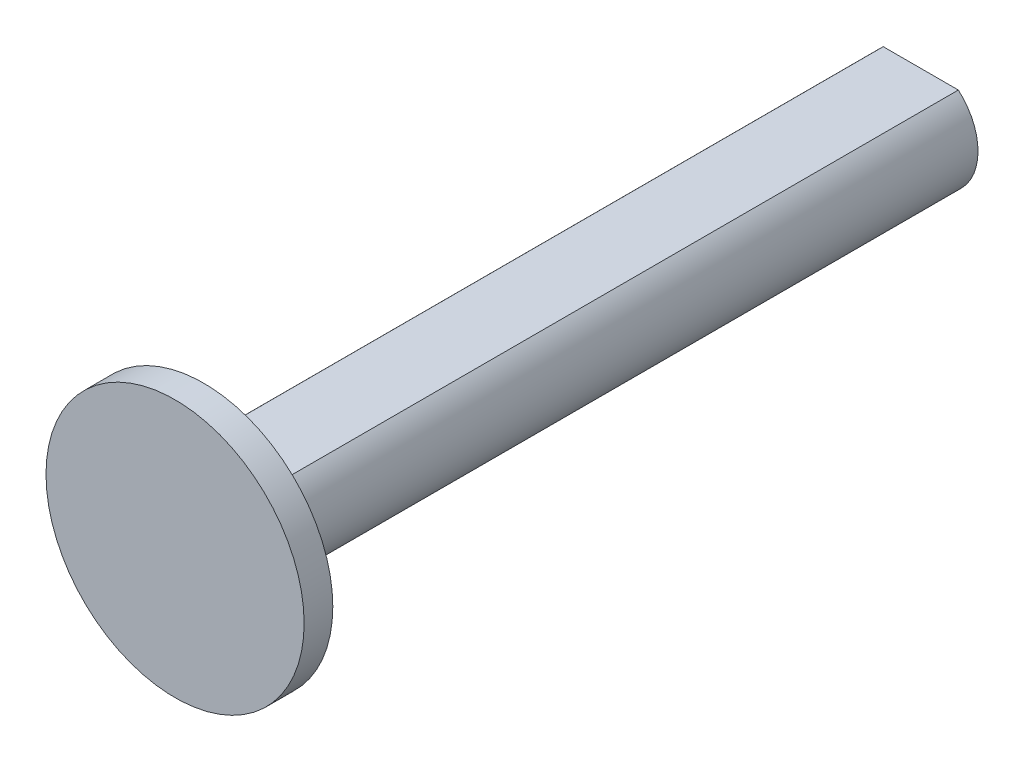
ISO-10303-21;
HEADER;
FILE_DESCRIPTION(('STEP AP214'),'2;1');
FILE_NAME('part.step','',(''),(''),'','','');
FILE_SCHEMA(('AUTOMOTIVE_DESIGN { 1 0 10303 214 1 1 1 1 }'));
ENDSEC;
DATA;
#1=APPLICATION_CONTEXT('core data for automotive mechanical design processes');
#2=APPLICATION_PROTOCOL_DEFINITION('international standard','automotive_design',2000,#1);
#3=PRODUCT_CONTEXT('',#1,'mechanical');
#4=PRODUCT('Part','Part','',(#3));
#5=PRODUCT_RELATED_PRODUCT_CATEGORY('part','',(#4));
#6=PRODUCT_DEFINITION_FORMATION('','',#4);
#7=PRODUCT_DEFINITION_CONTEXT('part definition',#1,'design');
#8=PRODUCT_DEFINITION('design','',#6,#7);
#9=PRODUCT_DEFINITION_SHAPE('','',#8);
#10=(LENGTH_UNIT() NAMED_UNIT(*) SI_UNIT(.MILLI.,.METRE.));
#11=(NAMED_UNIT(*) PLANE_ANGLE_UNIT() SI_UNIT($,.RADIAN.));
#12=(NAMED_UNIT(*) SI_UNIT($,.STERADIAN.) SOLID_ANGLE_UNIT());
#13=UNCERTAINTY_MEASURE_WITH_UNIT(LENGTH_MEASURE(1.E-05),#10,'distance_accuracy_value','');
#14=(GEOMETRIC_REPRESENTATION_CONTEXT(3) GLOBAL_UNCERTAINTY_ASSIGNED_CONTEXT((#13)) GLOBAL_UNIT_ASSIGNED_CONTEXT((#10,
#11,#12)) REPRESENTATION_CONTEXT('',''));
#15=CARTESIAN_POINT('',(0.,0.,0.));
#16=DIRECTION('',(0.,0.,1.));
#17=DIRECTION('',(1.,0.,0.));
#18=AXIS2_PLACEMENT_3D('',#15,#16,#17);
#19=CARTESIAN_POINT('',(0.,0.,26.));
#20=DIRECTION('',(0.,0.,-1.));
#21=DIRECTION('',(-1.,0.,0.));
#22=AXIS2_PLACEMENT_3D('',#19,#20,#21);
#23=CYLINDRICAL_SURFACE('',#22,3.99);
#24=CARTESIAN_POINT('',(0.,0.,24.));
#25=DIRECTION('',(0.,0.,1.));
#26=DIRECTION('',(1.,0.,0.));
#27=AXIS2_PLACEMENT_3D('',#24,#25,#26);
#28=CIRCLE('',#27,3.99);
#29=CARTESIAN_POINT('',(-2.61916017074176,3.01,24.));
#30=VERTEX_POINT('',#29);
#31=CARTESIAN_POINT('',(2.61916017074176,3.01,24.));
#32=VERTEX_POINT('',#31);
#33=EDGE_CURVE('E63',#30,#32,#28,.T.);
#34=ORIENTED_EDGE('',*,*,#33,.F.);
#35=DIRECTION('',(0.,0.,-1.));
#36=VECTOR('',#35,1.);
#37=CARTESIAN_POINT('',(-2.61916017074176,3.01,26.));
#38=LINE('',#37,#36);
#39=CARTESIAN_POINT('',(-2.61916017074176,3.01,-26.));
#40=VERTEX_POINT('',#39);
#41=EDGE_CURVE('E52',#30,#40,#38,.T.);
#42=ORIENTED_EDGE('',*,*,#41,.T.);
#43=CARTESIAN_POINT('',(0.,0.,-26.));
#44=DIRECTION('',(0.,0.,1.));
#45=DIRECTION('',(1.,0.,0.));
#46=AXIS2_PLACEMENT_3D('',#43,#44,#45);
#47=CIRCLE('',#46,3.99);
#48=CARTESIAN_POINT('',(2.61916017074176,3.01,-26.));
#49=VERTEX_POINT('',#48);
#50=EDGE_CURVE('E65',#40,#49,#47,.T.);
#51=ORIENTED_EDGE('',*,*,#50,.T.);
#52=DIRECTION('',(0.,0.,-1.));
#53=VECTOR('',#52,1.);
#54=CARTESIAN_POINT('',(2.61916017074176,3.01,26.));
#55=LINE('',#54,#53);
#56=EDGE_CURVE('E40',#32,#49,#55,.T.);
#57=ORIENTED_EDGE('',*,*,#56,.F.);
#58=EDGE_LOOP('',(#34,#42,#51,#57));
#59=FACE_BOUND('',#58,.T.);
#60=ADVANCED_FACE('F33',(#59),#23,.T.);
#61=CARTESIAN_POINT('',(-2.61916017074176,3.01,26.));
#62=DIRECTION('',(0.,-1.,0.));
#63=DIRECTION('',(0.,0.,-1.));
#64=AXIS2_PLACEMENT_3D('',#61,#62,#63);
#65=PLANE('',#64);
#66=DIRECTION('',(-1.,0.,0.));
#67=VECTOR('',#66,1.);
#68=CARTESIAN_POINT('',(-2.61916017074176,3.01,24.));
#69=LINE('',#68,#67);
#70=EDGE_CURVE('E11',#32,#30,#69,.T.);
#71=ORIENTED_EDGE('',*,*,#70,.F.);
#72=ORIENTED_EDGE('',*,*,#56,.T.);
#73=DIRECTION('',(-1.,0.,0.));
#74=VECTOR('',#73,1.);
#75=CARTESIAN_POINT('',(-2.61916017074176,3.01,-26.));
#76=LINE('',#75,#74);
#77=EDGE_CURVE('E59',#49,#40,#76,.T.);
#78=ORIENTED_EDGE('',*,*,#77,.T.);
#79=ORIENTED_EDGE('',*,*,#41,.F.);
#80=EDGE_LOOP('',(#71,#72,#78,#79));
#81=FACE_BOUND('',#80,.T.);
#82=ADVANCED_FACE('F57',(#81),#65,.F.);
#83=CARTESIAN_POINT('',(0.,0.,-26.));
#84=DIRECTION('',(0.,0.,1.));
#85=DIRECTION('',(1.,0.,0.));
#86=AXIS2_PLACEMENT_3D('',#83,#84,#85);
#87=PLANE('',#86);
#88=ORIENTED_EDGE('',*,*,#50,.F.);
#89=ORIENTED_EDGE('',*,*,#77,.F.);
#90=EDGE_LOOP('',(#88,#89));
#91=FACE_BOUND('',#90,.T.);
#92=ADVANCED_FACE('F71',(#91),#87,.F.);
#93=CARTESIAN_POINT('',(0.,0.,24.));
#94=DIRECTION('',(0.,0.,1.));
#95=DIRECTION('',(1.,0.,0.));
#96=AXIS2_PLACEMENT_3D('',#93,#94,#95);
#97=PLANE('',#96);
#98=CARTESIAN_POINT('',(0.,0.,24.));
#99=DIRECTION('',(0.,0.,1.));
#100=DIRECTION('',(1.,0.,0.));
#101=AXIS2_PLACEMENT_3D('',#98,#99,#100);
#102=CIRCLE('',#101,9.);
#103=CARTESIAN_POINT('',(9.,0.,24.));
#104=VERTEX_POINT('',#103);
#105=EDGE_CURVE('E66',#104,#104,#102,.T.);
#106=ORIENTED_EDGE('',*,*,#105,.F.);
#107=EDGE_LOOP('',(#106));
#108=FACE_BOUND('',#107,.T.);
#109=ORIENTED_EDGE('',*,*,#70,.T.);
#110=ORIENTED_EDGE('',*,*,#33,.T.);
#111=EDGE_LOOP('',(#109,#110));
#112=FACE_BOUND('',#111,.T.);
#113=ADVANCED_FACE('F68',(#108,#112),#97,.F.);
#114=CARTESIAN_POINT('',(0.,0.,24.));
#115=DIRECTION('',(0.,0.,1.));
#116=DIRECTION('',(1.,0.,0.));
#117=AXIS2_PLACEMENT_3D('',#114,#115,#116);
#118=CYLINDRICAL_SURFACE('',#117,9.);
#119=ORIENTED_EDGE('',*,*,#105,.T.);
#120=EDGE_LOOP('',(#119));
#121=FACE_BOUND('',#120,.T.);
#122=CARTESIAN_POINT('',(0.,0.,26.));
#123=DIRECTION('',(0.,0.,1.));
#124=DIRECTION('',(1.,0.,0.));
#125=AXIS2_PLACEMENT_3D('',#122,#123,#124);
#126=CIRCLE('',#125,9.);
#127=CARTESIAN_POINT('',(9.,0.,26.));
#128=VERTEX_POINT('',#127);
#129=EDGE_CURVE('E97',#128,#128,#126,.T.);
#130=ORIENTED_EDGE('',*,*,#129,.F.);
#131=EDGE_LOOP('',(#130));
#132=FACE_BOUND('',#131,.T.);
#133=ADVANCED_FACE('F70',(#121,#132),#118,.T.);
#134=CARTESIAN_POINT('',(0.,0.,26.));
#135=DIRECTION('',(0.,0.,1.));
#136=DIRECTION('',(1.,0.,0.));
#137=AXIS2_PLACEMENT_3D('',#134,#135,#136);
#138=PLANE('',#137);
#139=ORIENTED_EDGE('',*,*,#129,.T.);
#140=EDGE_LOOP('',(#139));
#141=FACE_BOUND('',#140,.T.);
#142=ADVANCED_FACE('F78',(#141),#138,.T.);
#143=CLOSED_SHELL('',(#60,#82,#92,#113,#133,#142));
#144=MANIFOLD_SOLID_BREP('B2',#143);
#145=ADVANCED_BREP_SHAPE_REPRESENTATION('',(#18,#144),#14);
#146=SHAPE_DEFINITION_REPRESENTATION(#9,#145);
ENDSEC;
END-ISO-10303-21;
